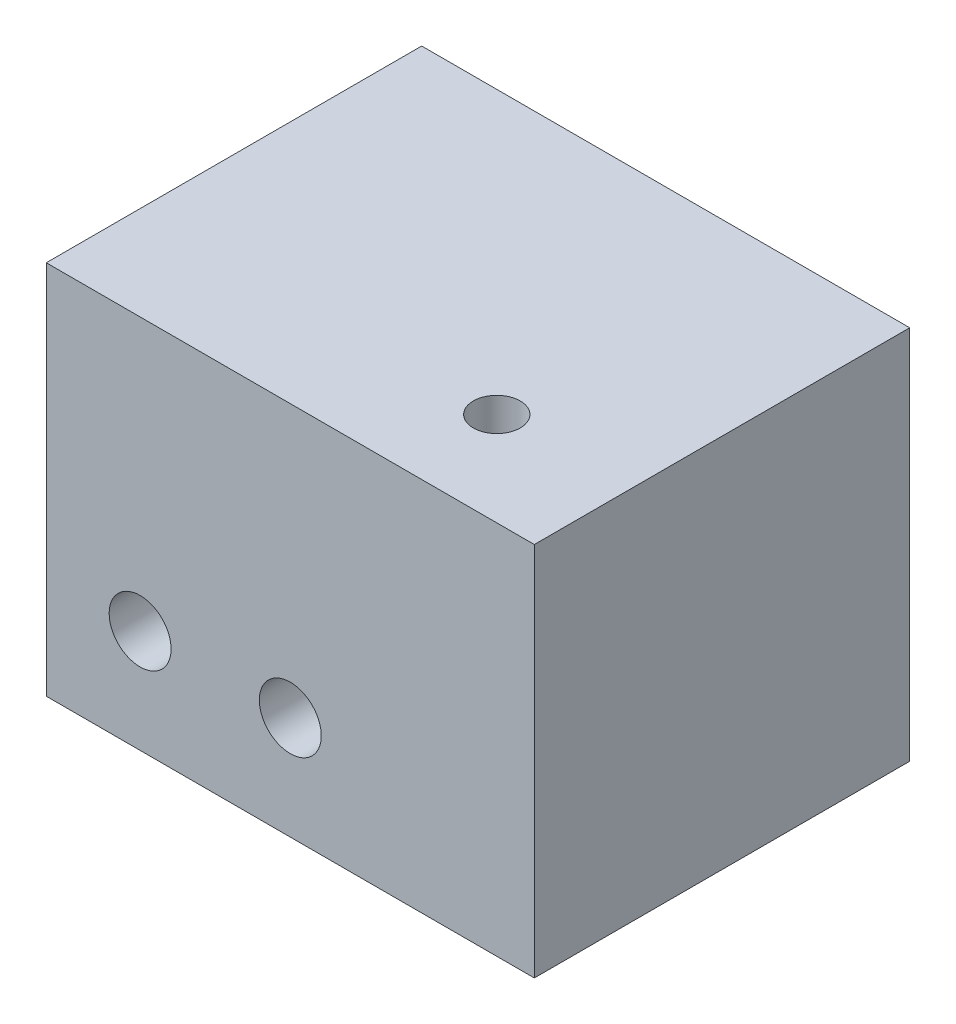
ISO-10303-21;
HEADER;
FILE_DESCRIPTION(('STEP AP214'),'2;1');
FILE_NAME('part.step','',(''),(''),'','','');
FILE_SCHEMA(('AUTOMOTIVE_DESIGN { 1 0 10303 214 1 1 1 1 }'));
ENDSEC;
DATA;
#1=APPLICATION_CONTEXT('core data for automotive mechanical design processes');
#2=APPLICATION_PROTOCOL_DEFINITION('international standard','automotive_design',2000,#1);
#3=PRODUCT_CONTEXT('',#1,'mechanical');
#4=PRODUCT('Part','Part','',(#3));
#5=PRODUCT_RELATED_PRODUCT_CATEGORY('part','',(#4));
#6=PRODUCT_DEFINITION_FORMATION('','',#4);
#7=PRODUCT_DEFINITION_CONTEXT('part definition',#1,'design');
#8=PRODUCT_DEFINITION('design','',#6,#7);
#9=PRODUCT_DEFINITION_SHAPE('','',#8);
#10=(LENGTH_UNIT() NAMED_UNIT(*) SI_UNIT(.MILLI.,.METRE.));
#11=(NAMED_UNIT(*) PLANE_ANGLE_UNIT() SI_UNIT($,.RADIAN.));
#12=(NAMED_UNIT(*) SI_UNIT($,.STERADIAN.) SOLID_ANGLE_UNIT());
#13=UNCERTAINTY_MEASURE_WITH_UNIT(LENGTH_MEASURE(1.E-05),#10,'distance_accuracy_value','');
#14=(GEOMETRIC_REPRESENTATION_CONTEXT(3) GLOBAL_UNCERTAINTY_ASSIGNED_CONTEXT((#13)) GLOBAL_UNIT_ASSIGNED_CONTEXT((#10,
#11,#12)) REPRESENTATION_CONTEXT('',''));
#15=CARTESIAN_POINT('',(0.,0.,0.));
#16=DIRECTION('',(0.,0.,1.));
#17=DIRECTION('',(1.,0.,0.));
#18=AXIS2_PLACEMENT_3D('',#15,#16,#17);
#19=CARTESIAN_POINT('',(13.,25.,10.));
#20=DIRECTION('',(-1.,0.,0.));
#21=DIRECTION('',(0.,0.,1.));
#22=AXIS2_PLACEMENT_3D('',#19,#20,#21);
#23=PLANE('',#22);
#24=DIRECTION('',(0.,-1.,0.));
#25=VECTOR('',#24,1.);
#26=CARTESIAN_POINT('',(13.,25.,10.));
#27=LINE('',#26,#25);
#28=CARTESIAN_POINT('',(13.,25.,10.));
#29=VERTEX_POINT('',#28);
#30=CARTESIAN_POINT('',(13.,5.,10.));
#31=VERTEX_POINT('',#30);
#32=EDGE_CURVE('E154',#29,#31,#27,.T.);
#33=ORIENTED_EDGE('',*,*,#32,.T.);
#34=DIRECTION('',(0.,0.,1.));
#35=VECTOR('',#34,1.);
#36=CARTESIAN_POINT('',(13.,5.,10.));
#37=LINE('',#36,#35);
#38=CARTESIAN_POINT('',(13.,5.,-10.));
#39=VERTEX_POINT('',#38);
#40=EDGE_CURVE('E130',#39,#31,#37,.T.);
#41=ORIENTED_EDGE('',*,*,#40,.F.);
#42=DIRECTION('',(0.,-1.,0.));
#43=VECTOR('',#42,1.);
#44=CARTESIAN_POINT('',(13.,25.,-10.));
#45=LINE('',#44,#43);
#46=CARTESIAN_POINT('',(13.,25.,-10.));
#47=VERTEX_POINT('',#46);
#48=EDGE_CURVE('E147',#47,#39,#45,.T.);
#49=ORIENTED_EDGE('',*,*,#48,.F.);
#50=DIRECTION('',(0.,0.,-1.));
#51=VECTOR('',#50,1.);
#52=CARTESIAN_POINT('',(13.,25.,10.));
#53=LINE('',#52,#51);
#54=EDGE_CURVE('E240',#29,#47,#53,.T.);
#55=ORIENTED_EDGE('',*,*,#54,.F.);
#56=EDGE_LOOP('',(#33,#41,#49,#55));
#57=FACE_BOUND('',#56,.T.);
#58=ADVANCED_FACE('F43',(#57),#23,.F.);
#59=CARTESIAN_POINT('',(-13.,25.,-10.));
#60=DIRECTION('',(0.,0.,1.));
#61=DIRECTION('',(1.,0.,0.));
#62=AXIS2_PLACEMENT_3D('',#59,#60,#61);
#63=PLANE('',#62);
#64=CARTESIAN_POINT('',(-8.,10.5,-10.));
#65=DIRECTION('',(0.,0.,-1.));
#66=DIRECTION('',(-1.,0.,0.));
#67=AXIS2_PLACEMENT_3D('',#64,#65,#66);
#68=CIRCLE('',#67,1.65);
#69=CARTESIAN_POINT('',(-9.65,10.5,-10.));
#70=VERTEX_POINT('',#69);
#71=EDGE_CURVE('E212',#70,#70,#68,.T.);
#72=ORIENTED_EDGE('',*,*,#71,.F.);
#73=EDGE_LOOP('',(#72));
#74=FACE_BOUND('',#73,.T.);
#75=CARTESIAN_POINT('',(0.,10.5,-10.));
#76=DIRECTION('',(0.,0.,-1.));
#77=DIRECTION('',(-1.,0.,0.));
#78=AXIS2_PLACEMENT_3D('',#75,#76,#77);
#79=CIRCLE('',#78,1.65);
#80=CARTESIAN_POINT('',(-1.65,10.5,-10.));
#81=VERTEX_POINT('',#80);
#82=EDGE_CURVE('E216',#81,#81,#79,.T.);
#83=ORIENTED_EDGE('',*,*,#82,.F.);
#84=EDGE_LOOP('',(#83));
#85=FACE_BOUND('',#84,.T.);
#86=ORIENTED_EDGE('',*,*,#48,.T.);
#87=DIRECTION('',(1.,0.,0.));
#88=VECTOR('',#87,1.);
#89=CARTESIAN_POINT('',(-13.,5.,-10.));
#90=LINE('',#89,#88);
#91=CARTESIAN_POINT('',(7.,5.,-10.));
#92=VERTEX_POINT('',#91);
#93=EDGE_CURVE('E129',#92,#39,#90,.T.);
#94=ORIENTED_EDGE('',*,*,#93,.F.);
#95=DIRECTION('',(0.,-1.,0.));
#96=VECTOR('',#95,1.);
#97=CARTESIAN_POINT('',(7.,16.,-10.));
#98=LINE('',#97,#96);
#99=CARTESIAN_POINT('',(7.,16.,-10.));
#100=VERTEX_POINT('',#99);
#101=EDGE_CURVE('E236',#100,#92,#98,.T.);
#102=ORIENTED_EDGE('',*,*,#101,.F.);
#103=DIRECTION('',(1.,0.,0.));
#104=VECTOR('',#103,1.);
#105=CARTESIAN_POINT('',(5.,16.,-10.));
#106=LINE('',#105,#104);
#107=CARTESIAN_POINT('',(5.,16.,-10.));
#108=VERTEX_POINT('',#107);
#109=EDGE_CURVE('E231',#108,#100,#106,.T.);
#110=ORIENTED_EDGE('',*,*,#109,.F.);
#111=DIRECTION('',(0.,-1.,0.));
#112=VECTOR('',#111,1.);
#113=CARTESIAN_POINT('',(5.,16.,-10.));
#114=LINE('',#113,#112);
#115=CARTESIAN_POINT('',(5.,5.,-10.));
#116=VERTEX_POINT('',#115);
#117=EDGE_CURVE('E141',#108,#116,#114,.T.);
#118=ORIENTED_EDGE('',*,*,#117,.T.);
#119=CARTESIAN_POINT('',(-13.,5.,-10.));
#120=VERTEX_POINT('',#119);
#121=EDGE_CURVE('E121',#120,#116,#90,.T.);
#122=ORIENTED_EDGE('',*,*,#121,.F.);
#123=DIRECTION('',(0.,-1.,0.));
#124=VECTOR('',#123,1.);
#125=CARTESIAN_POINT('',(-13.,25.,-10.));
#126=LINE('',#125,#124);
#127=CARTESIAN_POINT('',(-13.,25.,-10.));
#128=VERTEX_POINT('',#127);
#129=EDGE_CURVE('E137',#128,#120,#126,.T.);
#130=ORIENTED_EDGE('',*,*,#129,.F.);
#131=DIRECTION('',(-1.,0.,0.));
#132=VECTOR('',#131,1.);
#133=CARTESIAN_POINT('',(-13.,25.,-10.));
#134=LINE('',#133,#132);
#135=EDGE_CURVE('E246',#47,#128,#134,.T.);
#136=ORIENTED_EDGE('',*,*,#135,.F.);
#137=EDGE_LOOP('',(#86,#94,#102,#110,#118,#122,#130,#136));
#138=FACE_BOUND('',#137,.T.);
#139=ADVANCED_FACE('F136',(#74,#85,#138),#63,.F.);
#140=CARTESIAN_POINT('',(-13.,25.,10.));
#141=DIRECTION('',(1.,0.,0.));
#142=DIRECTION('',(0.,0.,-1.));
#143=AXIS2_PLACEMENT_3D('',#140,#141,#142);
#144=PLANE('',#143);
#145=ORIENTED_EDGE('',*,*,#129,.T.);
#146=DIRECTION('',(0.,0.,1.));
#147=VECTOR('',#146,1.);
#148=CARTESIAN_POINT('',(-13.,5.,10.));
#149=LINE('',#148,#147);
#150=CARTESIAN_POINT('',(-13.,5.,10.));
#151=VERTEX_POINT('',#150);
#152=EDGE_CURVE('E118',#120,#151,#149,.T.);
#153=ORIENTED_EDGE('',*,*,#152,.T.);
#154=DIRECTION('',(0.,-1.,0.));
#155=VECTOR('',#154,1.);
#156=CARTESIAN_POINT('',(-13.,25.,10.));
#157=LINE('',#156,#155);
#158=CARTESIAN_POINT('',(-13.,25.,10.));
#159=VERTEX_POINT('',#158);
#160=EDGE_CURVE('E148',#159,#151,#157,.T.);
#161=ORIENTED_EDGE('',*,*,#160,.F.);
#162=DIRECTION('',(0.,0.,1.));
#163=VECTOR('',#162,1.);
#164=CARTESIAN_POINT('',(-13.,25.,10.));
#165=LINE('',#164,#163);
#166=EDGE_CURVE('E145',#128,#159,#165,.T.);
#167=ORIENTED_EDGE('',*,*,#166,.F.);
#168=EDGE_LOOP('',(#145,#153,#161,#167));
#169=FACE_BOUND('',#168,.T.);
#170=ADVANCED_FACE('F144',(#169),#144,.F.);
#171=CARTESIAN_POINT('',(-13.,25.,10.));
#172=DIRECTION('',(0.,0.,-1.));
#173=DIRECTION('',(-1.,0.,0.));
#174=AXIS2_PLACEMENT_3D('',#171,#172,#173);
#175=PLANE('',#174);
#176=CARTESIAN_POINT('',(-8.,10.5,10.));
#177=DIRECTION('',(0.,0.,-1.));
#178=DIRECTION('',(-1.,0.,0.));
#179=AXIS2_PLACEMENT_3D('',#176,#177,#178);
#180=CIRCLE('',#179,1.65);
#181=CARTESIAN_POINT('',(-9.65,10.5,10.));
#182=VERTEX_POINT('',#181);
#183=EDGE_CURVE('E207',#182,#182,#180,.T.);
#184=ORIENTED_EDGE('',*,*,#183,.T.);
#185=EDGE_LOOP('',(#184));
#186=FACE_BOUND('',#185,.T.);
#187=CARTESIAN_POINT('',(0.,10.5,10.));
#188=DIRECTION('',(0.,0.,-1.));
#189=DIRECTION('',(-1.,0.,0.));
#190=AXIS2_PLACEMENT_3D('',#187,#188,#189);
#191=CIRCLE('',#190,1.65);
#192=CARTESIAN_POINT('',(-1.65,10.5,10.));
#193=VERTEX_POINT('',#192);
#194=EDGE_CURVE('E202',#193,#193,#191,.T.);
#195=ORIENTED_EDGE('',*,*,#194,.T.);
#196=EDGE_LOOP('',(#195));
#197=FACE_BOUND('',#196,.T.);
#198=ORIENTED_EDGE('',*,*,#160,.T.);
#199=DIRECTION('',(1.,0.,0.));
#200=VECTOR('',#199,1.);
#201=CARTESIAN_POINT('',(-13.,5.,10.));
#202=LINE('',#201,#200);
#203=EDGE_CURVE('E123',#151,#31,#202,.T.);
#204=ORIENTED_EDGE('',*,*,#203,.T.);
#205=ORIENTED_EDGE('',*,*,#32,.F.);
#206=DIRECTION('',(1.,0.,0.));
#207=VECTOR('',#206,1.);
#208=CARTESIAN_POINT('',(-13.,25.,10.));
#209=LINE('',#208,#207);
#210=EDGE_CURVE('E251',#159,#29,#209,.T.);
#211=ORIENTED_EDGE('',*,*,#210,.F.);
#212=EDGE_LOOP('',(#198,#204,#205,#211));
#213=FACE_BOUND('',#212,.T.);
#214=ADVANCED_FACE('F262',(#186,#197,#213),#175,.F.);
#215=CARTESIAN_POINT('',(0.,25.,0.));
#216=DIRECTION('',(0.,-1.,0.));
#217=DIRECTION('',(0.,0.,-1.));
#218=AXIS2_PLACEMENT_3D('',#215,#216,#217);
#219=PLANE('',#218);
#220=CARTESIAN_POINT('',(6.,25.,5.));
#221=DIRECTION('',(0.,-1.,0.));
#222=DIRECTION('',(0.,0.,-1.));
#223=AXIS2_PLACEMENT_3D('',#220,#221,#222);
#224=CIRCLE('',#223,1.25);
#225=CARTESIAN_POINT('',(6.,25.,3.75));
#226=VERTEX_POINT('',#225);
#227=EDGE_CURVE('E190',#226,#226,#224,.T.);
#228=ORIENTED_EDGE('',*,*,#227,.T.);
#229=EDGE_LOOP('',(#228));
#230=FACE_BOUND('',#229,.T.);
#231=ORIENTED_EDGE('',*,*,#54,.T.);
#232=ORIENTED_EDGE('',*,*,#135,.T.);
#233=ORIENTED_EDGE('',*,*,#166,.T.);
#234=ORIENTED_EDGE('',*,*,#210,.T.);
#235=EDGE_LOOP('',(#231,#232,#233,#234));
#236=FACE_BOUND('',#235,.T.);
#237=ADVANCED_FACE('F282',(#230,#236),#219,.F.);
#238=CARTESIAN_POINT('',(6.,16.,5.));
#239=DIRECTION('',(0.,-1.,0.));
#240=DIRECTION('',(0.,0.,-1.));
#241=AXIS2_PLACEMENT_3D('',#238,#239,#240);
#242=CYLINDRICAL_SURFACE('',#241,3.1);
#243=DIRECTION('',(0.,-1.,0.));
#244=VECTOR('',#243,1.);
#245=CARTESIAN_POINT('',(7.8235294117647,16.,2.49306153158298));
#246=LINE('',#245,#244);
#247=CARTESIAN_POINT('',(7.8235294117647,16.,2.49306153158298));
#248=VERTEX_POINT('',#247);
#249=CARTESIAN_POINT('',(7.8235294117647,5.,2.49306153158298));
#250=VERTEX_POINT('',#249);
#251=EDGE_CURVE('E160',#248,#250,#246,.T.);
#252=ORIENTED_EDGE('',*,*,#251,.T.);
#253=CARTESIAN_POINT('',(6.,5.,5.));
#254=DIRECTION('',(0.,1.,0.));
#255=DIRECTION('',(0.,0.,1.));
#256=AXIS2_PLACEMENT_3D('',#253,#254,#255);
#257=CIRCLE('',#256,3.1);
#258=CARTESIAN_POINT('',(4.17647058823529,5.,2.49306153158298));
#259=VERTEX_POINT('',#258);
#260=EDGE_CURVE('E198',#250,#259,#257,.F.);
#261=ORIENTED_EDGE('',*,*,#260,.T.);
#262=DIRECTION('',(0.,-1.,0.));
#263=VECTOR('',#262,1.);
#264=CARTESIAN_POINT('',(4.17647058823529,16.,2.49306153158298));
#265=LINE('',#264,#263);
#266=CARTESIAN_POINT('',(4.17647058823529,16.,2.49306153158298));
#267=VERTEX_POINT('',#266);
#268=EDGE_CURVE('E152',#259,#267,#265,.F.);
#269=ORIENTED_EDGE('',*,*,#268,.T.);
#270=CARTESIAN_POINT('',(6.,16.,5.));
#271=DIRECTION('',(0.,-1.,0.));
#272=DIRECTION('',(0.,0.,-1.));
#273=AXIS2_PLACEMENT_3D('',#270,#271,#272);
#274=CIRCLE('',#273,3.1);
#275=EDGE_CURVE('E178',#248,#267,#274,.T.);
#276=ORIENTED_EDGE('',*,*,#275,.F.);
#277=EDGE_LOOP('',(#252,#261,#269,#276));
#278=FACE_BOUND('',#277,.T.);
#279=ADVANCED_FACE('F185',(#278),#242,.F.);
#280=CARTESIAN_POINT('',(7.,16.,2.06571984977576));
#281=DIRECTION('',(1.,0.,0.));
#282=DIRECTION('',(0.,0.,-1.));
#283=AXIS2_PLACEMENT_3D('',#280,#281,#282);
#284=PLANE('',#283);
#285=ORIENTED_EDGE('',*,*,#101,.T.);
#286=DIRECTION('',(0.,0.,1.));
#287=VECTOR('',#286,1.);
#288=CARTESIAN_POINT('',(7.,5.,2.06571984977576));
#289=LINE('',#288,#287);
#290=CARTESIAN_POINT('',(7.,5.,0.875681874539743));
#291=VERTEX_POINT('',#290);
#292=EDGE_CURVE('E197',#92,#291,#289,.T.);
#293=ORIENTED_EDGE('',*,*,#292,.T.);
#294=DIRECTION('',(0.,-1.,0.));
#295=VECTOR('',#294,1.);
#296=CARTESIAN_POINT('',(7.,16.,0.875681874539743));
#297=LINE('',#296,#295);
#298=CARTESIAN_POINT('',(7.,16.,0.875681874539743));
#299=VERTEX_POINT('',#298);
#300=EDGE_CURVE('E164',#291,#299,#297,.F.);
#301=ORIENTED_EDGE('',*,*,#300,.T.);
#302=DIRECTION('',(0.,0.,1.));
#303=VECTOR('',#302,1.);
#304=CARTESIAN_POINT('',(7.,16.,2.06571984977576));
#305=LINE('',#304,#303);
#306=EDGE_CURVE('E180',#100,#299,#305,.T.);
#307=ORIENTED_EDGE('',*,*,#306,.F.);
#308=EDGE_LOOP('',(#285,#293,#301,#307));
#309=FACE_BOUND('',#308,.T.);
#310=ADVANCED_FACE('F272',(#309),#284,.F.);
#311=CARTESIAN_POINT('',(5.,16.,2.06571984977576));
#312=DIRECTION('',(-1.,0.,0.));
#313=DIRECTION('',(0.,0.,1.));
#314=AXIS2_PLACEMENT_3D('',#311,#312,#313);
#315=PLANE('',#314);
#316=DIRECTION('',(0.,-1.,0.));
#317=VECTOR('',#316,1.);
#318=CARTESIAN_POINT('',(5.,16.,0.875681874539745));
#319=LINE('',#318,#317);
#320=CARTESIAN_POINT('',(5.,16.,0.875681874539745));
#321=VERTEX_POINT('',#320);
#322=CARTESIAN_POINT('',(5.,5.,0.875681874539745));
#323=VERTEX_POINT('',#322);
#324=EDGE_CURVE('E167',#321,#323,#319,.T.);
#325=ORIENTED_EDGE('',*,*,#324,.T.);
#326=DIRECTION('',(0.,0.,-1.));
#327=VECTOR('',#326,1.);
#328=CARTESIAN_POINT('',(5.,5.,2.06571984977576));
#329=LINE('',#328,#327);
#330=EDGE_CURVE('E58',#323,#116,#329,.T.);
#331=ORIENTED_EDGE('',*,*,#330,.T.);
#332=ORIENTED_EDGE('',*,*,#117,.F.);
#333=DIRECTION('',(0.,0.,-1.));
#334=VECTOR('',#333,1.);
#335=CARTESIAN_POINT('',(5.,16.,2.06571984977576));
#336=LINE('',#335,#334);
#337=EDGE_CURVE('E189',#321,#108,#336,.T.);
#338=ORIENTED_EDGE('',*,*,#337,.F.);
#339=EDGE_LOOP('',(#325,#331,#332,#338));
#340=FACE_BOUND('',#339,.T.);
#341=ADVANCED_FACE('F274',(#340),#315,.F.);
#342=CARTESIAN_POINT('',(6.,16.,5.));
#343=DIRECTION('',(0.,-1.,0.));
#344=DIRECTION('',(0.,0.,-1.));
#345=AXIS2_PLACEMENT_3D('',#342,#343,#344);
#346=PLANE('',#345);
#347=CARTESIAN_POINT('',(6.,16.,5.));
#348=DIRECTION('',(0.,-1.,0.));
#349=DIRECTION('',(0.,0.,-1.));
#350=AXIS2_PLACEMENT_3D('',#347,#348,#349);
#351=CIRCLE('',#350,1.25);
#352=CARTESIAN_POINT('',(6.,16.,3.75));
#353=VERTEX_POINT('',#352);
#354=EDGE_CURVE('E211',#353,#353,#351,.T.);
#355=ORIENTED_EDGE('',*,*,#354,.F.);
#356=EDGE_LOOP('',(#355));
#357=FACE_BOUND('',#356,.T.);
#358=ORIENTED_EDGE('',*,*,#306,.T.);
#359=CARTESIAN_POINT('',(9.,16.,0.875681874539743));
#360=DIRECTION('',(0.,-1.,0.));
#361=DIRECTION('',(0.,0.,-1.));
#362=AXIS2_PLACEMENT_3D('',#359,#360,#361);
#363=CIRCLE('',#362,2.);
#364=EDGE_CURVE('E171',#299,#248,#363,.F.);
#365=ORIENTED_EDGE('',*,*,#364,.T.);
#366=ORIENTED_EDGE('',*,*,#275,.T.);
#367=CARTESIAN_POINT('',(3.,16.,0.875681874539744));
#368=DIRECTION('',(0.,-1.,0.));
#369=DIRECTION('',(0.,0.,-1.));
#370=AXIS2_PLACEMENT_3D('',#367,#368,#369);
#371=CIRCLE('',#370,2.);
#372=EDGE_CURVE('E52',#267,#321,#371,.F.);
#373=ORIENTED_EDGE('',*,*,#372,.T.);
#374=ORIENTED_EDGE('',*,*,#337,.T.);
#375=ORIENTED_EDGE('',*,*,#109,.T.);
#376=EDGE_LOOP('',(#358,#365,#366,#373,#374,#375));
#377=FACE_BOUND('',#376,.T.);
#378=ADVANCED_FACE('F177',(#357,#377),#346,.T.);
#379=CARTESIAN_POINT('',(9.,16.,0.875681874539743));
#380=DIRECTION('',(0.,-1.,0.));
#381=DIRECTION('',(0.,0.,-1.));
#382=AXIS2_PLACEMENT_3D('',#379,#380,#381);
#383=CYLINDRICAL_SURFACE('',#382,2.);
#384=CARTESIAN_POINT('',(9.,5.,0.875681874539743));
#385=DIRECTION('',(0.,1.,0.));
#386=DIRECTION('',(0.,0.,1.));
#387=AXIS2_PLACEMENT_3D('',#384,#385,#386);
#388=CIRCLE('',#387,2.);
#389=EDGE_CURVE('E194',#250,#291,#388,.F.);
#390=ORIENTED_EDGE('',*,*,#389,.F.);
#391=ORIENTED_EDGE('',*,*,#251,.F.);
#392=ORIENTED_EDGE('',*,*,#364,.F.);
#393=ORIENTED_EDGE('',*,*,#300,.F.);
#394=EDGE_LOOP('',(#390,#391,#392,#393));
#395=FACE_BOUND('',#394,.T.);
#396=ADVANCED_FACE('F193',(#395),#383,.T.);
#397=CARTESIAN_POINT('',(3.,16.,0.875681874539744));
#398=DIRECTION('',(0.,-1.,0.));
#399=DIRECTION('',(0.,0.,-1.));
#400=AXIS2_PLACEMENT_3D('',#397,#398,#399);
#401=CYLINDRICAL_SURFACE('',#400,2.);
#402=CARTESIAN_POINT('',(3.,5.,0.875681874539744));
#403=DIRECTION('',(0.,1.,0.));
#404=DIRECTION('',(0.,0.,1.));
#405=AXIS2_PLACEMENT_3D('',#402,#403,#404);
#406=CIRCLE('',#405,2.);
#407=EDGE_CURVE('E11',#323,#259,#406,.F.);
#408=ORIENTED_EDGE('',*,*,#407,.F.);
#409=ORIENTED_EDGE('',*,*,#324,.F.);
#410=ORIENTED_EDGE('',*,*,#372,.F.);
#411=ORIENTED_EDGE('',*,*,#268,.F.);
#412=EDGE_LOOP('',(#408,#409,#410,#411));
#413=FACE_BOUND('',#412,.T.);
#414=ADVANCED_FACE('F45',(#413),#401,.T.);
#415=CARTESIAN_POINT('',(6.,25.,5.));
#416=DIRECTION('',(0.,-1.,0.));
#417=DIRECTION('',(0.,0.,-1.));
#418=AXIS2_PLACEMENT_3D('',#415,#416,#417);
#419=CYLINDRICAL_SURFACE('',#418,1.25);
#420=ORIENTED_EDGE('',*,*,#227,.F.);
#421=EDGE_LOOP('',(#420));
#422=FACE_BOUND('',#421,.T.);
#423=ORIENTED_EDGE('',*,*,#354,.T.);
#424=EDGE_LOOP('',(#423));
#425=FACE_BOUND('',#424,.T.);
#426=ADVANCED_FACE('F298',(#422,#425),#419,.F.);
#427=CARTESIAN_POINT('',(0.,10.5,10.));
#428=DIRECTION('',(0.,0.,-1.));
#429=DIRECTION('',(-1.,0.,0.));
#430=AXIS2_PLACEMENT_3D('',#427,#428,#429);
#431=CYLINDRICAL_SURFACE('',#430,1.65);
#432=ORIENTED_EDGE('',*,*,#194,.F.);
#433=EDGE_LOOP('',(#432));
#434=FACE_BOUND('',#433,.T.);
#435=ORIENTED_EDGE('',*,*,#82,.T.);
#436=EDGE_LOOP('',(#435));
#437=FACE_BOUND('',#436,.T.);
#438=ADVANCED_FACE('F307',(#434,#437),#431,.F.);
#439=CARTESIAN_POINT('',(-8.,10.5,10.));
#440=DIRECTION('',(0.,0.,-1.));
#441=DIRECTION('',(-1.,0.,0.));
#442=AXIS2_PLACEMENT_3D('',#439,#440,#441);
#443=CYLINDRICAL_SURFACE('',#442,1.65);
#444=ORIENTED_EDGE('',*,*,#183,.F.);
#445=EDGE_LOOP('',(#444));
#446=FACE_BOUND('',#445,.T.);
#447=ORIENTED_EDGE('',*,*,#71,.T.);
#448=EDGE_LOOP('',(#447));
#449=FACE_BOUND('',#448,.T.);
#450=ADVANCED_FACE('F311',(#446,#449),#443,.F.);
#451=CARTESIAN_POINT('',(-13.,5.,10.));
#452=DIRECTION('',(0.,1.,0.));
#453=DIRECTION('',(0.,0.,1.));
#454=AXIS2_PLACEMENT_3D('',#451,#452,#453);
#455=PLANE('',#454);
#456=ORIENTED_EDGE('',*,*,#93,.T.);
#457=ORIENTED_EDGE('',*,*,#40,.T.);
#458=ORIENTED_EDGE('',*,*,#203,.F.);
#459=ORIENTED_EDGE('',*,*,#152,.F.);
#460=ORIENTED_EDGE('',*,*,#121,.T.);
#461=ORIENTED_EDGE('',*,*,#330,.F.);
#462=ORIENTED_EDGE('',*,*,#407,.T.);
#463=ORIENTED_EDGE('',*,*,#260,.F.);
#464=ORIENTED_EDGE('',*,*,#389,.T.);
#465=ORIENTED_EDGE('',*,*,#292,.F.);
#466=EDGE_LOOP('',(#456,#457,#458,#459,#460,#461,#462,#463,#464,#465));
#467=FACE_BOUND('',#466,.T.);
#468=ADVANCED_FACE('F120',(#467),#455,.F.);
#469=CLOSED_SHELL('',(#58,#139,#170,#214,#237,#279,#310,#341,#378,#396,#414,#426,#438,#450,#468));
#470=MANIFOLD_SOLID_BREP('B2',#469);
#471=ADVANCED_BREP_SHAPE_REPRESENTATION('',(#18,#470),#14);
#472=SHAPE_DEFINITION_REPRESENTATION(#9,#471);
ENDSEC;
END-ISO-10303-21;
